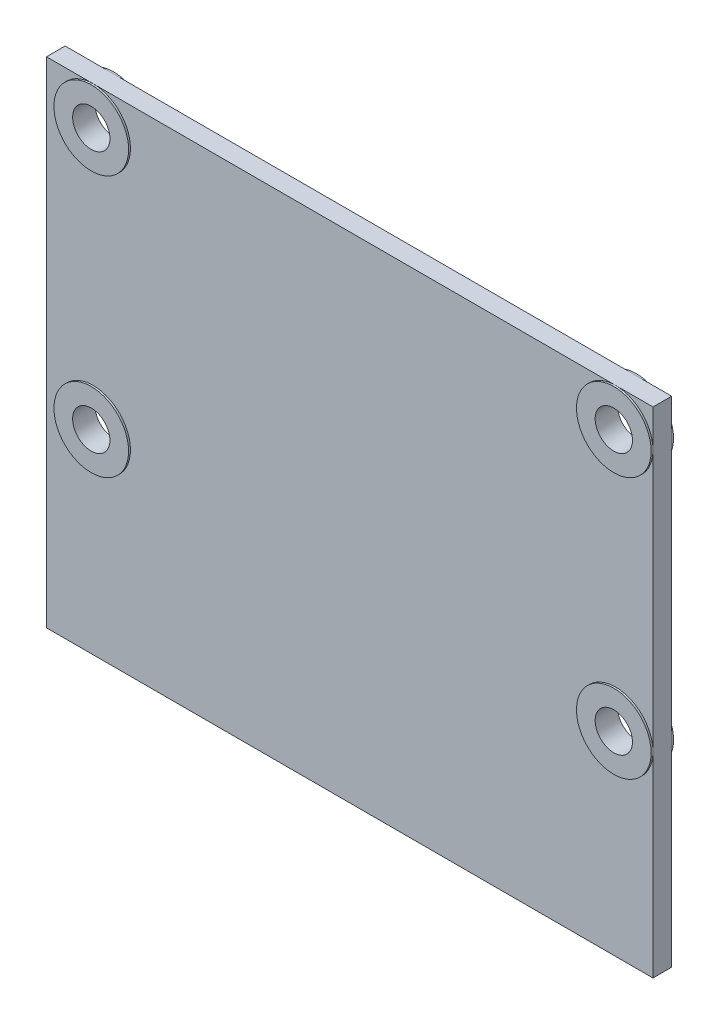
ISO-10303-21;
HEADER;
FILE_DESCRIPTION(('STEP AP214'),'2;1');
FILE_NAME('part.step','',(''),(''),'','','');
FILE_SCHEMA(('AUTOMOTIVE_DESIGN { 1 0 10303 214 1 1 1 1 }'));
ENDSEC;
DATA;
#1=APPLICATION_CONTEXT('core data for automotive mechanical design processes');
#2=APPLICATION_PROTOCOL_DEFINITION('international standard','automotive_design',2000,#1);
#3=PRODUCT_CONTEXT('',#1,'mechanical');
#4=PRODUCT('Part','Part','',(#3));
#5=PRODUCT_RELATED_PRODUCT_CATEGORY('part','',(#4));
#6=PRODUCT_DEFINITION_FORMATION('','',#4);
#7=PRODUCT_DEFINITION_CONTEXT('part definition',#1,'design');
#8=PRODUCT_DEFINITION('design','',#6,#7);
#9=PRODUCT_DEFINITION_SHAPE('','',#8);
#10=(LENGTH_UNIT() NAMED_UNIT(*) SI_UNIT(.MILLI.,.METRE.));
#11=(NAMED_UNIT(*) PLANE_ANGLE_UNIT() SI_UNIT($,.RADIAN.));
#12=(NAMED_UNIT(*) SI_UNIT($,.STERADIAN.) SOLID_ANGLE_UNIT());
#13=UNCERTAINTY_MEASURE_WITH_UNIT(LENGTH_MEASURE(1.E-05),#10,'distance_accuracy_value','');
#14=(GEOMETRIC_REPRESENTATION_CONTEXT(3) GLOBAL_UNCERTAINTY_ASSIGNED_CONTEXT((#13)) GLOBAL_UNIT_ASSIGNED_CONTEXT((#10,
#11,#12)) REPRESENTATION_CONTEXT('',''));
#15=CARTESIAN_POINT('',(0.,0.,0.));
#16=DIRECTION('',(0.,0.,1.));
#17=DIRECTION('',(1.,0.,0.));
#18=AXIS2_PLACEMENT_3D('',#15,#16,#17);
#19=CARTESIAN_POINT('',(0.,0.,1.));
#20=DIRECTION('',(0.,0.,1.));
#21=DIRECTION('',(1.,0.,0.));
#22=AXIS2_PLACEMENT_3D('',#19,#20,#21);
#23=PLANE('',#22);
#24=CARTESIAN_POINT('',(14.25,11.25,1.));
#25=DIRECTION('',(0.,0.,1.));
#26=DIRECTION('',(1.,0.,0.));
#27=AXIS2_PLACEMENT_3D('',#24,#25,#26);
#28=CIRCLE('',#27,2.);
#29=CARTESIAN_POINT('',(16.25,11.25,1.));
#30=VERTEX_POINT('',#29);
#31=CARTESIAN_POINT('',(14.25,13.25,1.));
#32=VERTEX_POINT('',#31);
#33=EDGE_CURVE('E225',#30,#32,#28,.T.);
#34=ORIENTED_EDGE('',*,*,#33,.F.);
#35=DIRECTION('',(0.,1.,0.));
#36=VECTOR('',#35,1.);
#37=CARTESIAN_POINT('',(16.25,13.25,1.));
#38=LINE('',#37,#36);
#39=CARTESIAN_POINT('',(16.25,13.25,1.));
#40=VERTEX_POINT('',#39);
#41=EDGE_CURVE('E127',#30,#40,#38,.T.);
#42=ORIENTED_EDGE('',*,*,#41,.T.);
#43=DIRECTION('',(-1.,0.,0.));
#44=VECTOR('',#43,1.);
#45=CARTESIAN_POINT('',(-16.25,13.25,1.));
#46=LINE('',#45,#44);
#47=EDGE_CURVE('E139',#40,#32,#46,.T.);
#48=ORIENTED_EDGE('',*,*,#47,.T.);
#49=EDGE_LOOP('',(#34,#42,#48));
#50=FACE_BOUND('',#49,.T.);
#51=ADVANCED_FACE('F47',(#50),#23,.T.);
#52=CARTESIAN_POINT('',(0.,0.,0.));
#53=DIRECTION('',(0.,0.,1.));
#54=DIRECTION('',(1.,0.,0.));
#55=AXIS2_PLACEMENT_3D('',#52,#53,#54);
#56=PLANE('',#55);
#57=DIRECTION('',(0.,1.,0.));
#58=VECTOR('',#57,1.);
#59=CARTESIAN_POINT('',(16.25,13.25,0.));
#60=LINE('',#59,#58);
#61=CARTESIAN_POINT('',(16.25,11.25,0.));
#62=VERTEX_POINT('',#61);
#63=CARTESIAN_POINT('',(16.25,13.25,0.));
#64=VERTEX_POINT('',#63);
#65=EDGE_CURVE('E155',#62,#64,#60,.T.);
#66=ORIENTED_EDGE('',*,*,#65,.F.);
#67=CARTESIAN_POINT('',(14.25,11.25,0.));
#68=DIRECTION('',(0.,0.,1.));
#69=DIRECTION('',(1.,0.,0.));
#70=AXIS2_PLACEMENT_3D('',#67,#68,#69);
#71=CIRCLE('',#70,2.);
#72=CARTESIAN_POINT('',(14.25,13.25,0.));
#73=VERTEX_POINT('',#72);
#74=EDGE_CURVE('E57',#62,#73,#71,.T.);
#75=ORIENTED_EDGE('',*,*,#74,.T.);
#76=DIRECTION('',(-1.,0.,0.));
#77=VECTOR('',#76,1.);
#78=CARTESIAN_POINT('',(-16.25,13.25,0.));
#79=LINE('',#78,#77);
#80=EDGE_CURVE('E156',#64,#73,#79,.T.);
#81=ORIENTED_EDGE('',*,*,#80,.F.);
#82=EDGE_LOOP('',(#66,#75,#81));
#83=FACE_BOUND('',#82,.T.);
#84=ADVANCED_FACE('F258',(#83),#56,.F.);
#85=CARTESIAN_POINT('',(16.25,13.25,1.));
#86=DIRECTION('',(-1.,0.,0.));
#87=DIRECTION('',(0.,-1.,0.));
#88=AXIS2_PLACEMENT_3D('',#85,#86,#87);
#89=PLANE('',#88);
#90=CARTESIAN_POINT('',(16.25,-13.25,0.));
#91=VERTEX_POINT('',#90);
#92=CARTESIAN_POINT('',(16.25,-2.75,0.));
#93=VERTEX_POINT('',#92);
#94=EDGE_CURVE('E150',#91,#93,#60,.T.);
#95=ORIENTED_EDGE('',*,*,#94,.T.);
#96=EDGE_CURVE('E154',#93,#62,#60,.T.);
#97=ORIENTED_EDGE('',*,*,#96,.T.);
#98=ORIENTED_EDGE('',*,*,#65,.T.);
#99=DIRECTION('',(0.,0.,-1.));
#100=VECTOR('',#99,1.);
#101=CARTESIAN_POINT('',(16.25,13.25,1.));
#102=LINE('',#101,#100);
#103=EDGE_CURVE('E176',#40,#64,#102,.T.);
#104=ORIENTED_EDGE('',*,*,#103,.F.);
#105=ORIENTED_EDGE('',*,*,#41,.F.);
#106=CARTESIAN_POINT('',(16.25,-2.75,1.));
#107=VERTEX_POINT('',#106);
#108=EDGE_CURVE('E125',#107,#30,#38,.T.);
#109=ORIENTED_EDGE('',*,*,#108,.F.);
#110=CARTESIAN_POINT('',(16.25,-13.25,1.));
#111=VERTEX_POINT('',#110);
#112=EDGE_CURVE('E113',#111,#107,#38,.T.);
#113=ORIENTED_EDGE('',*,*,#112,.F.);
#114=DIRECTION('',(0.,0.,-1.));
#115=VECTOR('',#114,1.);
#116=CARTESIAN_POINT('',(16.25,-13.25,1.));
#117=LINE('',#116,#115);
#118=EDGE_CURVE('E149',#111,#91,#117,.T.);
#119=ORIENTED_EDGE('',*,*,#118,.T.);
#120=EDGE_LOOP('',(#95,#97,#98,#104,#105,#109,#113,#119));
#121=FACE_BOUND('',#120,.T.);
#122=ADVANCED_FACE('F49',(#121),#89,.F.);
#123=CARTESIAN_POINT('',(-16.25,13.25,1.));
#124=DIRECTION('',(0.,-1.,0.));
#125=DIRECTION('',(0.,0.,-1.));
#126=AXIS2_PLACEMENT_3D('',#123,#124,#125);
#127=PLANE('',#126);
#128=ORIENTED_EDGE('',*,*,#80,.T.);
#129=CARTESIAN_POINT('',(-13.75,13.25,0.));
#130=VERTEX_POINT('',#129);
#131=EDGE_CURVE('E161',#73,#130,#79,.T.);
#132=ORIENTED_EDGE('',*,*,#131,.T.);
#133=CARTESIAN_POINT('',(-16.25,13.25,0.));
#134=VERTEX_POINT('',#133);
#135=EDGE_CURVE('E153',#130,#134,#79,.T.);
#136=ORIENTED_EDGE('',*,*,#135,.T.);
#137=DIRECTION('',(0.,0.,-1.));
#138=VECTOR('',#137,1.);
#139=CARTESIAN_POINT('',(-16.25,13.25,1.));
#140=LINE('',#139,#138);
#141=CARTESIAN_POINT('',(-16.25,13.25,1.));
#142=VERTEX_POINT('',#141);
#143=EDGE_CURVE('E172',#142,#134,#140,.T.);
#144=ORIENTED_EDGE('',*,*,#143,.F.);
#145=CARTESIAN_POINT('',(-13.75,13.25,1.));
#146=VERTEX_POINT('',#145);
#147=EDGE_CURVE('E124',#146,#142,#46,.T.);
#148=ORIENTED_EDGE('',*,*,#147,.F.);
#149=EDGE_CURVE('E144',#32,#146,#46,.T.);
#150=ORIENTED_EDGE('',*,*,#149,.F.);
#151=ORIENTED_EDGE('',*,*,#47,.F.);
#152=ORIENTED_EDGE('',*,*,#103,.T.);
#153=EDGE_LOOP('',(#128,#132,#136,#144,#148,#150,#151,#152));
#154=FACE_BOUND('',#153,.T.);
#155=ADVANCED_FACE('F416',(#154),#127,.F.);
#156=CARTESIAN_POINT('',(-16.25,13.25,1.));
#157=DIRECTION('',(1.,0.,0.));
#158=DIRECTION('',(0.,0.,-1.));
#159=AXIS2_PLACEMENT_3D('',#156,#157,#158);
#160=PLANE('',#159);
#161=DIRECTION('',(0.,-1.,0.));
#162=VECTOR('',#161,1.);
#163=CARTESIAN_POINT('',(-16.25,13.25,0.));
#164=LINE('',#163,#162);
#165=CARTESIAN_POINT('',(-16.25,-13.25,0.));
#166=VERTEX_POINT('',#165);
#167=EDGE_CURVE('E160',#134,#166,#164,.T.);
#168=ORIENTED_EDGE('',*,*,#167,.T.);
#169=DIRECTION('',(0.,0.,-1.));
#170=VECTOR('',#169,1.);
#171=CARTESIAN_POINT('',(-16.25,-13.25,1.));
#172=LINE('',#171,#170);
#173=CARTESIAN_POINT('',(-16.25,-13.25,1.));
#174=VERTEX_POINT('',#173);
#175=EDGE_CURVE('E168',#174,#166,#172,.T.);
#176=ORIENTED_EDGE('',*,*,#175,.F.);
#177=DIRECTION('',(0.,-1.,0.));
#178=VECTOR('',#177,1.);
#179=CARTESIAN_POINT('',(-16.25,13.25,1.));
#180=LINE('',#179,#178);
#181=EDGE_CURVE('E143',#142,#174,#180,.T.);
#182=ORIENTED_EDGE('',*,*,#181,.F.);
#183=ORIENTED_EDGE('',*,*,#143,.T.);
#184=EDGE_LOOP('',(#168,#176,#182,#183));
#185=FACE_BOUND('',#184,.T.);
#186=ADVANCED_FACE('F275',(#185),#160,.F.);
#187=CARTESIAN_POINT('',(-16.25,-13.25,1.));
#188=DIRECTION('',(0.,1.,0.));
#189=DIRECTION('',(0.,0.,1.));
#190=AXIS2_PLACEMENT_3D('',#187,#188,#189);
#191=PLANE('',#190);
#192=DIRECTION('',(1.,0.,0.));
#193=VECTOR('',#192,1.);
#194=CARTESIAN_POINT('',(-16.25,-13.25,0.));
#195=LINE('',#194,#193);
#196=EDGE_CURVE('E134',#166,#91,#195,.T.);
#197=ORIENTED_EDGE('',*,*,#196,.T.);
#198=ORIENTED_EDGE('',*,*,#118,.F.);
#199=DIRECTION('',(1.,0.,0.));
#200=VECTOR('',#199,1.);
#201=CARTESIAN_POINT('',(-16.25,-13.25,1.));
#202=LINE('',#201,#200);
#203=EDGE_CURVE('E119',#174,#111,#202,.T.);
#204=ORIENTED_EDGE('',*,*,#203,.F.);
#205=ORIENTED_EDGE('',*,*,#175,.T.);
#206=EDGE_LOOP('',(#197,#198,#204,#205));
#207=FACE_BOUND('',#206,.T.);
#208=ADVANCED_FACE('F270',(#207),#191,.F.);
#209=CARTESIAN_POINT('',(-13.75,-2.75,1.));
#210=DIRECTION('',(0.,0.,1.));
#211=DIRECTION('',(1.,0.,0.));
#212=AXIS2_PLACEMENT_3D('',#209,#210,#211);
#213=CIRCLE('',#212,2.);
#214=CARTESIAN_POINT('',(-11.75,-2.75,1.));
#215=VERTEX_POINT('',#214);
#216=EDGE_CURVE('E11',#215,#215,#213,.T.);
#217=ORIENTED_EDGE('',*,*,#216,.F.);
#218=EDGE_LOOP('',(#217));
#219=FACE_BOUND('',#218,.T.);
#220=ORIENTED_EDGE('',*,*,#112,.T.);
#221=CARTESIAN_POINT('',(14.25,-2.75,1.));
#222=DIRECTION('',(0.,0.,1.));
#223=DIRECTION('',(1.,0.,0.));
#224=AXIS2_PLACEMENT_3D('',#221,#222,#223);
#225=CIRCLE('',#224,2.);
#226=EDGE_CURVE('E117',#107,#107,#225,.T.);
#227=ORIENTED_EDGE('',*,*,#226,.F.);
#228=ORIENTED_EDGE('',*,*,#108,.T.);
#229=EDGE_CURVE('E70',#32,#30,#28,.T.);
#230=ORIENTED_EDGE('',*,*,#229,.F.);
#231=ORIENTED_EDGE('',*,*,#149,.T.);
#232=CARTESIAN_POINT('',(-13.75,11.25,1.));
#233=DIRECTION('',(0.,0.,1.));
#234=DIRECTION('',(1.,0.,0.));
#235=AXIS2_PLACEMENT_3D('',#232,#233,#234);
#236=CIRCLE('',#235,2.);
#237=EDGE_CURVE('E137',#146,#146,#236,.T.);
#238=ORIENTED_EDGE('',*,*,#237,.F.);
#239=ORIENTED_EDGE('',*,*,#147,.T.);
#240=ORIENTED_EDGE('',*,*,#181,.T.);
#241=ORIENTED_EDGE('',*,*,#203,.T.);
#242=EDGE_LOOP('',(#220,#227,#228,#230,#231,#238,#239,#240,#241));
#243=FACE_BOUND('',#242,.T.);
#244=ADVANCED_FACE('F115',(#219,#243),#23,.T.);
#245=CARTESIAN_POINT('',(-13.75,-2.75,0.));
#246=DIRECTION('',(0.,0.,1.));
#247=DIRECTION('',(1.,0.,0.));
#248=AXIS2_PLACEMENT_3D('',#245,#246,#247);
#249=CIRCLE('',#248,2.);
#250=CARTESIAN_POINT('',(-11.75,-2.75,0.));
#251=VERTEX_POINT('',#250);
#252=EDGE_CURVE('E51',#251,#251,#249,.T.);
#253=ORIENTED_EDGE('',*,*,#252,.T.);
#254=EDGE_LOOP('',(#253));
#255=FACE_BOUND('',#254,.T.);
#256=ORIENTED_EDGE('',*,*,#96,.F.);
#257=CARTESIAN_POINT('',(14.25,-2.75,0.));
#258=DIRECTION('',(0.,0.,1.));
#259=DIRECTION('',(1.,0.,0.));
#260=AXIS2_PLACEMENT_3D('',#257,#258,#259);
#261=CIRCLE('',#260,2.);
#262=EDGE_CURVE('E63',#93,#93,#261,.T.);
#263=ORIENTED_EDGE('',*,*,#262,.T.);
#264=ORIENTED_EDGE('',*,*,#94,.F.);
#265=ORIENTED_EDGE('',*,*,#196,.F.);
#266=ORIENTED_EDGE('',*,*,#167,.F.);
#267=ORIENTED_EDGE('',*,*,#135,.F.);
#268=CARTESIAN_POINT('',(-13.75,11.25,0.));
#269=DIRECTION('',(0.,0.,1.));
#270=DIRECTION('',(1.,0.,0.));
#271=AXIS2_PLACEMENT_3D('',#268,#269,#270);
#272=CIRCLE('',#271,2.);
#273=EDGE_CURVE('E181',#130,#130,#272,.T.);
#274=ORIENTED_EDGE('',*,*,#273,.T.);
#275=ORIENTED_EDGE('',*,*,#131,.F.);
#276=EDGE_CURVE('E180',#73,#62,#71,.T.);
#277=ORIENTED_EDGE('',*,*,#276,.T.);
#278=EDGE_LOOP('',(#256,#263,#264,#265,#266,#267,#274,#275,#277));
#279=FACE_BOUND('',#278,.T.);
#280=ADVANCED_FACE('F246',(#255,#279),#56,.F.);
#281=CARTESIAN_POINT('',(0.,0.,-0.1));
#282=DIRECTION('',(0.,0.,1.));
#283=DIRECTION('',(1.,0.,0.));
#284=AXIS2_PLACEMENT_3D('',#281,#282,#283);
#285=PLANE('',#284);
#286=CARTESIAN_POINT('',(-13.75,11.25,-0.1));
#287=DIRECTION('',(0.,0.,1.));
#288=DIRECTION('',(1.,0.,0.));
#289=AXIS2_PLACEMENT_3D('',#286,#287,#288);
#290=CIRCLE('',#289,1.);
#291=CARTESIAN_POINT('',(-12.75,11.25,-0.1));
#292=VERTEX_POINT('',#291);
#293=EDGE_CURVE('E234',#292,#292,#290,.F.);
#294=ORIENTED_EDGE('',*,*,#293,.F.);
#295=EDGE_LOOP('',(#294));
#296=FACE_BOUND('',#295,.T.);
#297=CARTESIAN_POINT('',(-13.75,11.25,-0.1));
#298=DIRECTION('',(0.,0.,1.));
#299=DIRECTION('',(1.,0.,0.));
#300=AXIS2_PLACEMENT_3D('',#297,#298,#299);
#301=CIRCLE('',#300,2.);
#302=CARTESIAN_POINT('',(-11.75,11.25,-0.1));
#303=VERTEX_POINT('',#302);
#304=EDGE_CURVE('E185',#303,#303,#301,.T.);
#305=ORIENTED_EDGE('',*,*,#304,.F.);
#306=EDGE_LOOP('',(#305));
#307=FACE_BOUND('',#306,.T.);
#308=ADVANCED_FACE('F244',(#296,#307),#285,.F.);
#309=CARTESIAN_POINT('',(-13.75,11.25,-0.1));
#310=DIRECTION('',(0.,0.,1.));
#311=DIRECTION('',(1.,0.,0.));
#312=AXIS2_PLACEMENT_3D('',#309,#310,#311);
#313=CYLINDRICAL_SURFACE('',#312,2.);
#314=ORIENTED_EDGE('',*,*,#304,.T.);
#315=EDGE_LOOP('',(#314));
#316=FACE_BOUND('',#315,.T.);
#317=ORIENTED_EDGE('',*,*,#273,.F.);
#318=EDGE_LOOP('',(#317));
#319=FACE_BOUND('',#318,.T.);
#320=ADVANCED_FACE('F241',(#316,#319),#313,.T.);
#321=CARTESIAN_POINT('',(-13.75,11.25,-1.));
#322=DIRECTION('',(0.,0.,1.));
#323=DIRECTION('',(1.,0.,0.));
#324=AXIS2_PLACEMENT_3D('',#321,#322,#323);
#325=CYLINDRICAL_SURFACE('',#324,1.);
#326=ORIENTED_EDGE('',*,*,#293,.T.);
#327=EDGE_LOOP('',(#326));
#328=FACE_BOUND('',#327,.T.);
#329=CARTESIAN_POINT('',(-13.75,11.25,1.1));
#330=DIRECTION('',(0.,0.,1.));
#331=DIRECTION('',(1.,0.,0.));
#332=AXIS2_PLACEMENT_3D('',#329,#330,#331);
#333=CIRCLE('',#332,1.);
#334=CARTESIAN_POINT('',(-12.75,11.25,1.1));
#335=VERTEX_POINT('',#334);
#336=EDGE_CURVE('E226',#335,#335,#333,.F.);
#337=ORIENTED_EDGE('',*,*,#336,.F.);
#338=EDGE_LOOP('',(#337));
#339=FACE_BOUND('',#338,.T.);
#340=ADVANCED_FACE('F253',(#328,#339),#325,.F.);
#341=ORIENTED_EDGE('',*,*,#237,.T.);
#342=EDGE_LOOP('',(#341));
#343=FACE_BOUND('',#342,.T.);
#344=CARTESIAN_POINT('',(-13.75,11.25,1.1));
#345=DIRECTION('',(0.,0.,1.));
#346=DIRECTION('',(1.,0.,0.));
#347=AXIS2_PLACEMENT_3D('',#344,#345,#346);
#348=CIRCLE('',#347,2.);
#349=CARTESIAN_POINT('',(-11.75,11.25,1.1));
#350=VERTEX_POINT('',#349);
#351=EDGE_CURVE('E230',#350,#350,#348,.T.);
#352=ORIENTED_EDGE('',*,*,#351,.F.);
#353=EDGE_LOOP('',(#352));
#354=FACE_BOUND('',#353,.T.);
#355=ADVANCED_FACE('F255',(#343,#354),#313,.T.);
#356=CARTESIAN_POINT('',(0.,0.,1.1));
#357=DIRECTION('',(0.,0.,1.));
#358=DIRECTION('',(1.,0.,0.));
#359=AXIS2_PLACEMENT_3D('',#356,#357,#358);
#360=PLANE('',#359);
#361=ORIENTED_EDGE('',*,*,#336,.T.);
#362=EDGE_LOOP('',(#361));
#363=FACE_BOUND('',#362,.T.);
#364=ORIENTED_EDGE('',*,*,#351,.T.);
#365=EDGE_LOOP('',(#364));
#366=FACE_BOUND('',#365,.T.);
#367=ADVANCED_FACE('F373',(#363,#366),#360,.T.);
#368=CARTESIAN_POINT('',(0.,0.,-0.1));
#369=DIRECTION('',(0.,0.,1.));
#370=DIRECTION('',(1.,0.,0.));
#371=AXIS2_PLACEMENT_3D('',#368,#369,#370);
#372=PLANE('',#371);
#373=CARTESIAN_POINT('',(14.25,11.25,-0.1));
#374=DIRECTION('',(0.,0.,1.));
#375=DIRECTION('',(1.,0.,0.));
#376=AXIS2_PLACEMENT_3D('',#373,#374,#375);
#377=CIRCLE('',#376,1.);
#378=CARTESIAN_POINT('',(15.25,11.25,-0.1));
#379=VERTEX_POINT('',#378);
#380=EDGE_CURVE('E215',#379,#379,#377,.F.);
#381=ORIENTED_EDGE('',*,*,#380,.F.);
#382=EDGE_LOOP('',(#381));
#383=FACE_BOUND('',#382,.T.);
#384=CARTESIAN_POINT('',(14.25,11.25,-0.1));
#385=DIRECTION('',(0.,0.,1.));
#386=DIRECTION('',(1.,0.,0.));
#387=AXIS2_PLACEMENT_3D('',#384,#385,#386);
#388=CIRCLE('',#387,2.);
#389=CARTESIAN_POINT('',(16.25,11.25,-0.1));
#390=VERTEX_POINT('',#389);
#391=EDGE_CURVE('E219',#390,#390,#388,.T.);
#392=ORIENTED_EDGE('',*,*,#391,.F.);
#393=EDGE_LOOP('',(#392));
#394=FACE_BOUND('',#393,.T.);
#395=ADVANCED_FACE('F380',(#383,#394),#372,.F.);
#396=CARTESIAN_POINT('',(14.25,11.25,-0.1));
#397=DIRECTION('',(0.,0.,1.));
#398=DIRECTION('',(1.,0.,0.));
#399=AXIS2_PLACEMENT_3D('',#396,#397,#398);
#400=CYLINDRICAL_SURFACE('',#399,2.);
#401=ORIENTED_EDGE('',*,*,#391,.T.);
#402=EDGE_LOOP('',(#401));
#403=FACE_BOUND('',#402,.T.);
#404=ORIENTED_EDGE('',*,*,#74,.F.);
#405=ORIENTED_EDGE('',*,*,#276,.F.);
#406=EDGE_LOOP('',(#404,#405));
#407=FACE_BOUND('',#406,.T.);
#408=ADVANCED_FACE('F366',(#403,#407),#400,.T.);
#409=CARTESIAN_POINT('',(14.25,11.25,-1.));
#410=DIRECTION('',(0.,0.,1.));
#411=DIRECTION('',(1.,0.,0.));
#412=AXIS2_PLACEMENT_3D('',#409,#410,#411);
#413=CYLINDRICAL_SURFACE('',#412,1.);
#414=ORIENTED_EDGE('',*,*,#380,.T.);
#415=EDGE_LOOP('',(#414));
#416=FACE_BOUND('',#415,.T.);
#417=CARTESIAN_POINT('',(14.25,11.25,1.1));
#418=DIRECTION('',(0.,0.,1.));
#419=DIRECTION('',(1.,0.,0.));
#420=AXIS2_PLACEMENT_3D('',#417,#418,#419);
#421=CIRCLE('',#420,1.);
#422=CARTESIAN_POINT('',(15.25,11.25,1.1));
#423=VERTEX_POINT('',#422);
#424=EDGE_CURVE('E195',#423,#423,#421,.F.);
#425=ORIENTED_EDGE('',*,*,#424,.F.);
#426=EDGE_LOOP('',(#425));
#427=FACE_BOUND('',#426,.T.);
#428=ADVANCED_FACE('F364',(#416,#427),#413,.F.);
#429=ORIENTED_EDGE('',*,*,#229,.T.);
#430=ORIENTED_EDGE('',*,*,#33,.T.);
#431=EDGE_LOOP('',(#429,#430));
#432=FACE_BOUND('',#431,.T.);
#433=CARTESIAN_POINT('',(14.25,11.25,1.1));
#434=DIRECTION('',(0.,0.,1.));
#435=DIRECTION('',(1.,0.,0.));
#436=AXIS2_PLACEMENT_3D('',#433,#434,#435);
#437=CIRCLE('',#436,2.);
#438=CARTESIAN_POINT('',(16.25,11.25,1.1));
#439=VERTEX_POINT('',#438);
#440=EDGE_CURVE('E211',#439,#439,#437,.T.);
#441=ORIENTED_EDGE('',*,*,#440,.F.);
#442=EDGE_LOOP('',(#441));
#443=FACE_BOUND('',#442,.T.);
#444=ADVANCED_FACE('F342',(#432,#443),#400,.T.);
#445=CARTESIAN_POINT('',(0.,0.,1.1));
#446=DIRECTION('',(0.,0.,1.));
#447=DIRECTION('',(1.,0.,0.));
#448=AXIS2_PLACEMENT_3D('',#445,#446,#447);
#449=PLANE('',#448);
#450=ORIENTED_EDGE('',*,*,#424,.T.);
#451=EDGE_LOOP('',(#450));
#452=FACE_BOUND('',#451,.T.);
#453=ORIENTED_EDGE('',*,*,#440,.T.);
#454=EDGE_LOOP('',(#453));
#455=FACE_BOUND('',#454,.T.);
#456=ADVANCED_FACE('F337',(#452,#455),#449,.T.);
#457=CARTESIAN_POINT('',(0.,0.,-0.1));
#458=DIRECTION('',(0.,0.,1.));
#459=DIRECTION('',(1.,0.,0.));
#460=AXIS2_PLACEMENT_3D('',#457,#458,#459);
#461=PLANE('',#460);
#462=CARTESIAN_POINT('',(14.25,-2.75,-0.1));
#463=DIRECTION('',(0.,0.,1.));
#464=DIRECTION('',(1.,0.,0.));
#465=AXIS2_PLACEMENT_3D('',#462,#463,#464);
#466=CIRCLE('',#465,1.);
#467=CARTESIAN_POINT('',(15.25,-2.75,-0.1));
#468=VERTEX_POINT('',#467);
#469=EDGE_CURVE('E198',#468,#468,#466,.F.);
#470=ORIENTED_EDGE('',*,*,#469,.F.);
#471=EDGE_LOOP('',(#470));
#472=FACE_BOUND('',#471,.T.);
#473=CARTESIAN_POINT('',(14.25,-2.75,-0.1));
#474=DIRECTION('',(0.,0.,1.));
#475=DIRECTION('',(1.,0.,0.));
#476=AXIS2_PLACEMENT_3D('',#473,#474,#475);
#477=CIRCLE('',#476,2.);
#478=CARTESIAN_POINT('',(16.25,-2.75,-0.1));
#479=VERTEX_POINT('',#478);
#480=EDGE_CURVE('E189',#479,#479,#477,.T.);
#481=ORIENTED_EDGE('',*,*,#480,.F.);
#482=EDGE_LOOP('',(#481));
#483=FACE_BOUND('',#482,.T.);
#484=ADVANCED_FACE('F333',(#472,#483),#461,.F.);
#485=CARTESIAN_POINT('',(14.25,-2.75,-0.1));
#486=DIRECTION('',(0.,0.,1.));
#487=DIRECTION('',(1.,0.,0.));
#488=AXIS2_PLACEMENT_3D('',#485,#486,#487);
#489=CYLINDRICAL_SURFACE('',#488,2.);
#490=ORIENTED_EDGE('',*,*,#480,.T.);
#491=EDGE_LOOP('',(#490));
#492=FACE_BOUND('',#491,.T.);
#493=ORIENTED_EDGE('',*,*,#262,.F.);
#494=EDGE_LOOP('',(#493));
#495=FACE_BOUND('',#494,.T.);
#496=ADVANCED_FACE('F320',(#492,#495),#489,.T.);
#497=CARTESIAN_POINT('',(14.25,-2.75,-1.));
#498=DIRECTION('',(0.,0.,1.));
#499=DIRECTION('',(1.,0.,0.));
#500=AXIS2_PLACEMENT_3D('',#497,#498,#499);
#501=CYLINDRICAL_SURFACE('',#500,1.);
#502=ORIENTED_EDGE('',*,*,#469,.T.);
#503=EDGE_LOOP('',(#502));
#504=FACE_BOUND('',#503,.T.);
#505=CARTESIAN_POINT('',(14.25,-2.75,1.1));
#506=DIRECTION('',(0.,0.,1.));
#507=DIRECTION('',(1.,0.,0.));
#508=AXIS2_PLACEMENT_3D('',#505,#506,#507);
#509=CIRCLE('',#508,1.);
#510=CARTESIAN_POINT('',(15.25,-2.75,1.1));
#511=VERTEX_POINT('',#510);
#512=EDGE_CURVE('E306',#511,#511,#509,.F.);
#513=ORIENTED_EDGE('',*,*,#512,.F.);
#514=EDGE_LOOP('',(#513));
#515=FACE_BOUND('',#514,.T.);
#516=ADVANCED_FACE('F317',(#504,#515),#501,.F.);
#517=ORIENTED_EDGE('',*,*,#226,.T.);
#518=EDGE_LOOP('',(#517));
#519=FACE_BOUND('',#518,.T.);
#520=CARTESIAN_POINT('',(14.25,-2.75,1.1));
#521=DIRECTION('',(0.,0.,1.));
#522=DIRECTION('',(1.,0.,0.));
#523=AXIS2_PLACEMENT_3D('',#520,#521,#522);
#524=CIRCLE('',#523,2.);
#525=CARTESIAN_POINT('',(16.25,-2.75,1.1));
#526=VERTEX_POINT('',#525);
#527=EDGE_CURVE('E204',#526,#526,#524,.T.);
#528=ORIENTED_EDGE('',*,*,#527,.F.);
#529=EDGE_LOOP('',(#528));
#530=FACE_BOUND('',#529,.T.);
#531=ADVANCED_FACE('F315',(#519,#530),#489,.T.);
#532=CARTESIAN_POINT('',(0.,0.,1.1));
#533=DIRECTION('',(0.,0.,1.));
#534=DIRECTION('',(1.,0.,0.));
#535=AXIS2_PLACEMENT_3D('',#532,#533,#534);
#536=PLANE('',#535);
#537=ORIENTED_EDGE('',*,*,#512,.T.);
#538=EDGE_LOOP('',(#537));
#539=FACE_BOUND('',#538,.T.);
#540=ORIENTED_EDGE('',*,*,#527,.T.);
#541=EDGE_LOOP('',(#540));
#542=FACE_BOUND('',#541,.T.);
#543=ADVANCED_FACE('F313',(#539,#542),#536,.T.);
#544=CARTESIAN_POINT('',(0.,0.,-0.1));
#545=DIRECTION('',(0.,0.,1.));
#546=DIRECTION('',(1.,0.,0.));
#547=AXIS2_PLACEMENT_3D('',#544,#545,#546);
#548=PLANE('',#547);
#549=CARTESIAN_POINT('',(-13.75,-2.75,-0.1));
#550=DIRECTION('',(0.,0.,1.));
#551=DIRECTION('',(1.,0.,0.));
#552=AXIS2_PLACEMENT_3D('',#549,#550,#551);
#553=CIRCLE('',#552,1.);
#554=CARTESIAN_POINT('',(-12.75,-2.75,-0.1));
#555=VERTEX_POINT('',#554);
#556=EDGE_CURVE('E292',#555,#555,#553,.F.);
#557=ORIENTED_EDGE('',*,*,#556,.F.);
#558=EDGE_LOOP('',(#557));
#559=FACE_BOUND('',#558,.T.);
#560=CARTESIAN_POINT('',(-13.75,-2.75,-0.1));
#561=DIRECTION('',(0.,0.,1.));
#562=DIRECTION('',(1.,0.,0.));
#563=AXIS2_PLACEMENT_3D('',#560,#561,#562);
#564=CIRCLE('',#563,2.);
#565=CARTESIAN_POINT('',(-11.75,-2.75,-0.1));
#566=VERTEX_POINT('',#565);
#567=EDGE_CURVE('E298',#566,#566,#564,.T.);
#568=ORIENTED_EDGE('',*,*,#567,.F.);
#569=EDGE_LOOP('',(#568));
#570=FACE_BOUND('',#569,.T.);
#571=ADVANCED_FACE('F325',(#559,#570),#548,.F.);
#572=CARTESIAN_POINT('',(-13.75,-2.75,-0.1));
#573=DIRECTION('',(0.,0.,1.));
#574=DIRECTION('',(1.,0.,0.));
#575=AXIS2_PLACEMENT_3D('',#572,#573,#574);
#576=CYLINDRICAL_SURFACE('',#575,2.);
#577=ORIENTED_EDGE('',*,*,#567,.T.);
#578=EDGE_LOOP('',(#577));
#579=FACE_BOUND('',#578,.T.);
#580=ORIENTED_EDGE('',*,*,#252,.F.);
#581=EDGE_LOOP('',(#580));
#582=FACE_BOUND('',#581,.T.);
#583=ADVANCED_FACE('F286',(#579,#582),#576,.T.);
#584=CARTESIAN_POINT('',(-13.75,-2.75,-1.));
#585=DIRECTION('',(0.,0.,1.));
#586=DIRECTION('',(1.,0.,0.));
#587=AXIS2_PLACEMENT_3D('',#584,#585,#586);
#588=CYLINDRICAL_SURFACE('',#587,1.);
#589=ORIENTED_EDGE('',*,*,#556,.T.);
#590=EDGE_LOOP('',(#589));
#591=FACE_BOUND('',#590,.T.);
#592=CARTESIAN_POINT('',(-13.75,-2.75,1.1));
#593=DIRECTION('',(0.,0.,1.));
#594=DIRECTION('',(1.,0.,0.));
#595=AXIS2_PLACEMENT_3D('',#592,#593,#594);
#596=CIRCLE('',#595,1.);
#597=CARTESIAN_POINT('',(-12.75,-2.75,1.1));
#598=VERTEX_POINT('',#597);
#599=EDGE_CURVE('E293',#598,#598,#596,.F.);
#600=ORIENTED_EDGE('',*,*,#599,.F.);
#601=EDGE_LOOP('',(#600));
#602=FACE_BOUND('',#601,.T.);
#603=ADVANCED_FACE('F284',(#591,#602),#588,.F.);
#604=ORIENTED_EDGE('',*,*,#216,.T.);
#605=EDGE_LOOP('',(#604));
#606=FACE_BOUND('',#605,.T.);
#607=CARTESIAN_POINT('',(-13.75,-2.75,1.1));
#608=DIRECTION('',(0.,0.,1.));
#609=DIRECTION('',(1.,0.,0.));
#610=AXIS2_PLACEMENT_3D('',#607,#608,#609);
#611=CIRCLE('',#610,2.);
#612=CARTESIAN_POINT('',(-11.75,-2.75,1.1));
#613=VERTEX_POINT('',#612);
#614=EDGE_CURVE('E289',#613,#613,#611,.T.);
#615=ORIENTED_EDGE('',*,*,#614,.F.);
#616=EDGE_LOOP('',(#615));
#617=FACE_BOUND('',#616,.T.);
#618=ADVANCED_FACE('F280',(#606,#617),#576,.T.);
#619=CARTESIAN_POINT('',(0.,0.,1.1));
#620=DIRECTION('',(0.,0.,1.));
#621=DIRECTION('',(1.,0.,0.));
#622=AXIS2_PLACEMENT_3D('',#619,#620,#621);
#623=PLANE('',#622);
#624=ORIENTED_EDGE('',*,*,#599,.T.);
#625=EDGE_LOOP('',(#624));
#626=FACE_BOUND('',#625,.T.);
#627=ORIENTED_EDGE('',*,*,#614,.T.);
#628=EDGE_LOOP('',(#627));
#629=FACE_BOUND('',#628,.T.);
#630=ADVANCED_FACE('F283',(#626,#629),#623,.T.);
#631=CLOSED_SHELL('',(#51,#84,#122,#155,#186,#208,#244,#280,#308,#320,#340,#355,#367,#395,#408,
#428,#444,#456,#484,#496,#516,#531,#543,#571,#583,#603,#618,#630));
#632=MANIFOLD_SOLID_BREP('B2',#631);
#633=ADVANCED_BREP_SHAPE_REPRESENTATION('',(#18,#632),#14);
#634=SHAPE_DEFINITION_REPRESENTATION(#9,#633);
ENDSEC;
END-ISO-10303-21;
